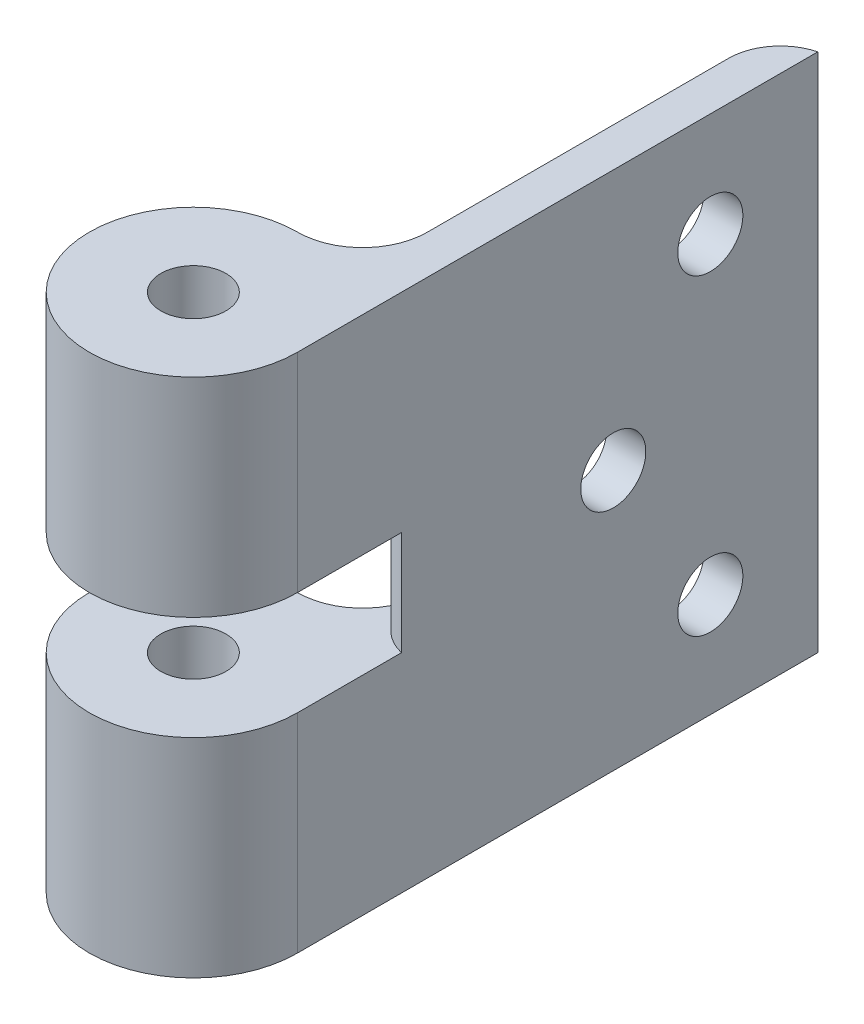
ISO-10303-21;
HEADER;
FILE_DESCRIPTION(('STEP AP214'),'2;1');
FILE_NAME('part.step','',(''),(''),'','','');
FILE_SCHEMA(('AUTOMOTIVE_DESIGN { 1 0 10303 214 1 1 1 1 }'));
ENDSEC;
DATA;
#1=APPLICATION_CONTEXT('core data for automotive mechanical design processes');
#2=APPLICATION_PROTOCOL_DEFINITION('international standard','automotive_design',2000,#1);
#3=PRODUCT_CONTEXT('',#1,'mechanical');
#4=PRODUCT('Part','Part','',(#3));
#5=PRODUCT_RELATED_PRODUCT_CATEGORY('part','',(#4));
#6=PRODUCT_DEFINITION_FORMATION('','',#4);
#7=PRODUCT_DEFINITION_CONTEXT('part definition',#1,'design');
#8=PRODUCT_DEFINITION('design','',#6,#7);
#9=PRODUCT_DEFINITION_SHAPE('','',#8);
#10=(LENGTH_UNIT() NAMED_UNIT(*) SI_UNIT(.MILLI.,.METRE.));
#11=(NAMED_UNIT(*) PLANE_ANGLE_UNIT() SI_UNIT($,.RADIAN.));
#12=(NAMED_UNIT(*) SI_UNIT($,.STERADIAN.) SOLID_ANGLE_UNIT());
#13=UNCERTAINTY_MEASURE_WITH_UNIT(LENGTH_MEASURE(1.E-05),#10,'distance_accuracy_value','');
#14=(GEOMETRIC_REPRESENTATION_CONTEXT(3) GLOBAL_UNCERTAINTY_ASSIGNED_CONTEXT((#13)) GLOBAL_UNIT_ASSIGNED_CONTEXT((#10,
#11,#12)) REPRESENTATION_CONTEXT('',''));
#15=CARTESIAN_POINT('',(0.,0.,0.));
#16=DIRECTION('',(0.,0.,1.));
#17=DIRECTION('',(1.,0.,0.));
#18=AXIS2_PLACEMENT_3D('',#15,#16,#17);
#19=CARTESIAN_POINT('',(0.,20.,0.));
#20=DIRECTION('',(0.,-1.,0.));
#21=DIRECTION('',(0.,0.,-1.));
#22=AXIS2_PLACEMENT_3D('',#19,#20,#21);
#23=CYLINDRICAL_SURFACE('',#22,4.);
#24=DIRECTION('',(0.,-1.,0.));
#25=VECTOR('',#24,1.);
#26=CARTESIAN_POINT('',(4.,20.,0.));
#27=LINE('',#26,#25);
#28=CARTESIAN_POINT('',(4.,8.,0.));
#29=VERTEX_POINT('',#28);
#30=CARTESIAN_POINT('',(4.,0.,0.));
#31=VERTEX_POINT('',#30);
#32=EDGE_CURVE('E202',#29,#31,#27,.T.);
#33=ORIENTED_EDGE('',*,*,#32,.F.);
#34=CARTESIAN_POINT('',(0.,8.,0.));
#35=DIRECTION('',(0.,-1.,0.));
#36=DIRECTION('',(0.,0.,-1.));
#37=AXIS2_PLACEMENT_3D('',#34,#35,#36);
#38=CIRCLE('',#37,4.);
#39=CARTESIAN_POINT('',(0.,8.,-4.));
#40=VERTEX_POINT('',#39);
#41=EDGE_CURVE('E117',#29,#40,#38,.T.);
#42=ORIENTED_EDGE('',*,*,#41,.T.);
#43=DIRECTION('',(0.,-1.,0.));
#44=VECTOR('',#43,1.);
#45=CARTESIAN_POINT('',(0.,20.,-4.));
#46=LINE('',#45,#44);
#47=CARTESIAN_POINT('',(0.,0.,-4.));
#48=VERTEX_POINT('',#47);
#49=EDGE_CURVE('E176',#40,#48,#46,.T.);
#50=ORIENTED_EDGE('',*,*,#49,.T.);
#51=CARTESIAN_POINT('',(0.,0.,0.));
#52=DIRECTION('',(0.,1.,0.));
#53=DIRECTION('',(0.,0.,1.));
#54=AXIS2_PLACEMENT_3D('',#51,#52,#53);
#55=CIRCLE('',#54,4.);
#56=EDGE_CURVE('E156',#48,#31,#55,.T.);
#57=ORIENTED_EDGE('',*,*,#56,.T.);
#58=EDGE_LOOP('',(#33,#42,#50,#57));
#59=FACE_BOUND('',#58,.T.);
#60=ADVANCED_FACE('F39',(#59),#23,.T.);
#61=CARTESIAN_POINT('',(0.,20.,0.));
#62=DIRECTION('',(0.,-1.,0.));
#63=DIRECTION('',(0.,0.,-1.));
#64=AXIS2_PLACEMENT_3D('',#61,#62,#63);
#65=CYLINDRICAL_SURFACE('',#64,1.25);
#66=CARTESIAN_POINT('',(0.,12.,0.));
#67=DIRECTION('',(0.,1.,0.));
#68=DIRECTION('',(0.,0.,1.));
#69=AXIS2_PLACEMENT_3D('',#66,#67,#68);
#70=CIRCLE('',#69,1.25);
#71=CARTESIAN_POINT('',(0.,12.,1.25));
#72=VERTEX_POINT('',#71);
#73=EDGE_CURVE('E135',#72,#72,#70,.T.);
#74=ORIENTED_EDGE('',*,*,#73,.F.);
#75=EDGE_LOOP('',(#74));
#76=FACE_BOUND('',#75,.T.);
#77=CARTESIAN_POINT('',(0.,20.,0.));
#78=DIRECTION('',(0.,1.,0.));
#79=DIRECTION('',(0.,0.,1.));
#80=AXIS2_PLACEMENT_3D('',#77,#78,#79);
#81=CIRCLE('',#80,1.25);
#82=CARTESIAN_POINT('',(0.,20.,1.25));
#83=VERTEX_POINT('',#82);
#84=EDGE_CURVE('E152',#83,#83,#81,.T.);
#85=ORIENTED_EDGE('',*,*,#84,.T.);
#86=EDGE_LOOP('',(#85));
#87=FACE_BOUND('',#86,.T.);
#88=ADVANCED_FACE('F286',(#76,#87),#65,.F.);
#89=CARTESIAN_POINT('',(0.,20.,0.));
#90=DIRECTION('',(0.,1.,0.));
#91=DIRECTION('',(0.,0.,1.));
#92=AXIS2_PLACEMENT_3D('',#89,#90,#91);
#93=PLANE('',#92);
#94=DIRECTION('',(0.,0.,-1.));
#95=VECTOR('',#94,1.);
#96=CARTESIAN_POINT('',(4.,20.,0.));
#97=LINE('',#96,#95);
#98=CARTESIAN_POINT('',(4.,20.,0.));
#99=VERTEX_POINT('',#98);
#100=CARTESIAN_POINT('',(4.,20.,-20.));
#101=VERTEX_POINT('',#100);
#102=EDGE_CURVE('E166',#99,#101,#97,.T.);
#103=ORIENTED_EDGE('',*,*,#102,.T.);
#104=CARTESIAN_POINT('',(4.5,20.,-18.0635083268963));
#105=DIRECTION('',(0.,1.,0.));
#106=DIRECTION('',(0.,0.,1.));
#107=AXIS2_PLACEMENT_3D('',#104,#105,#106);
#108=CIRCLE('',#107,2.);
#109=CARTESIAN_POINT('',(2.5,20.,-18.0635083268963));
#110=VERTEX_POINT('',#109);
#111=EDGE_CURVE('E229',#101,#110,#108,.T.);
#112=ORIENTED_EDGE('',*,*,#111,.T.);
#113=DIRECTION('',(0.,0.,1.));
#114=VECTOR('',#113,1.);
#115=CARTESIAN_POINT('',(2.5,20.,-15.1200276625702));
#116=LINE('',#115,#114);
#117=CARTESIAN_POINT('',(2.5,20.,-6.5));
#118=VERTEX_POINT('',#117);
#119=EDGE_CURVE('E170',#110,#118,#116,.T.);
#120=ORIENTED_EDGE('',*,*,#119,.T.);
#121=CARTESIAN_POINT('',(0.,20.,-6.5));
#122=DIRECTION('',(0.,-1.,0.));
#123=DIRECTION('',(0.,0.,-1.));
#124=AXIS2_PLACEMENT_3D('',#121,#122,#123);
#125=CIRCLE('',#124,2.5);
#126=CARTESIAN_POINT('',(0.,20.,-4.));
#127=VERTEX_POINT('',#126);
#128=EDGE_CURVE('E173',#118,#127,#125,.T.);
#129=ORIENTED_EDGE('',*,*,#128,.T.);
#130=CARTESIAN_POINT('',(0.,20.,0.));
#131=DIRECTION('',(0.,1.,0.));
#132=DIRECTION('',(0.,0.,1.));
#133=AXIS2_PLACEMENT_3D('',#130,#131,#132);
#134=CIRCLE('',#133,4.);
#135=EDGE_CURVE('E162',#127,#99,#134,.T.);
#136=ORIENTED_EDGE('',*,*,#135,.T.);
#137=EDGE_LOOP('',(#103,#112,#120,#129,#136));
#138=FACE_BOUND('',#137,.T.);
#139=ORIENTED_EDGE('',*,*,#84,.F.);
#140=EDGE_LOOP('',(#139));
#141=FACE_BOUND('',#140,.T.);
#142=ADVANCED_FACE('F261',(#138,#141),#93,.T.);
#143=CARTESIAN_POINT('',(0.,0.,0.));
#144=DIRECTION('',(0.,1.,0.));
#145=DIRECTION('',(0.,0.,1.));
#146=AXIS2_PLACEMENT_3D('',#143,#144,#145);
#147=PLANE('',#146);
#148=DIRECTION('',(0.,0.,1.));
#149=VECTOR('',#148,1.);
#150=CARTESIAN_POINT('',(2.5,0.,-6.5));
#151=LINE('',#150,#149);
#152=CARTESIAN_POINT('',(2.5,0.,-18.0635083268963));
#153=VERTEX_POINT('',#152);
#154=CARTESIAN_POINT('',(2.5,0.,-6.5));
#155=VERTEX_POINT('',#154);
#156=EDGE_CURVE('E184',#153,#155,#151,.T.);
#157=ORIENTED_EDGE('',*,*,#156,.F.);
#158=CARTESIAN_POINT('',(4.5,0.,-18.0635083268963));
#159=DIRECTION('',(0.,1.,0.));
#160=DIRECTION('',(0.,0.,1.));
#161=AXIS2_PLACEMENT_3D('',#158,#159,#160);
#162=CIRCLE('',#161,2.);
#163=CARTESIAN_POINT('',(4.,0.,-20.));
#164=VERTEX_POINT('',#163);
#165=EDGE_CURVE('E226',#153,#164,#162,.F.);
#166=ORIENTED_EDGE('',*,*,#165,.T.);
#167=DIRECTION('',(0.,0.,-1.));
#168=VECTOR('',#167,1.);
#169=CARTESIAN_POINT('',(4.,0.,0.));
#170=LINE('',#169,#168);
#171=EDGE_CURVE('E180',#31,#164,#170,.T.);
#172=ORIENTED_EDGE('',*,*,#171,.F.);
#173=ORIENTED_EDGE('',*,*,#56,.F.);
#174=CARTESIAN_POINT('',(0.,0.,-6.5));
#175=DIRECTION('',(0.,-1.,0.));
#176=DIRECTION('',(0.,0.,-1.));
#177=AXIS2_PLACEMENT_3D('',#174,#175,#176);
#178=CIRCLE('',#177,2.5);
#179=EDGE_CURVE('E167',#155,#48,#178,.T.);
#180=ORIENTED_EDGE('',*,*,#179,.F.);
#181=EDGE_LOOP('',(#157,#166,#172,#173,#180));
#182=FACE_BOUND('',#181,.T.);
#183=CARTESIAN_POINT('',(0.,0.,0.));
#184=DIRECTION('',(0.,1.,0.));
#185=DIRECTION('',(0.,0.,1.));
#186=AXIS2_PLACEMENT_3D('',#183,#184,#185);
#187=CIRCLE('',#186,1.25);
#188=CARTESIAN_POINT('',(0.,0.,1.25));
#189=VERTEX_POINT('',#188);
#190=EDGE_CURVE('E157',#189,#189,#187,.T.);
#191=ORIENTED_EDGE('',*,*,#190,.T.);
#192=EDGE_LOOP('',(#191));
#193=FACE_BOUND('',#192,.T.);
#194=ADVANCED_FACE('F249',(#182,#193),#147,.F.);
#195=CARTESIAN_POINT('',(0.,12.,-4.));
#196=VERTEX_POINT('',#195);
#197=EDGE_CURVE('E190',#127,#196,#46,.T.);
#198=ORIENTED_EDGE('',*,*,#197,.T.);
#199=CARTESIAN_POINT('',(0.,12.,0.));
#200=DIRECTION('',(0.,1.,0.));
#201=DIRECTION('',(0.,0.,1.));
#202=AXIS2_PLACEMENT_3D('',#199,#200,#201);
#203=CIRCLE('',#202,4.);
#204=CARTESIAN_POINT('',(4.,12.,0.));
#205=VERTEX_POINT('',#204);
#206=EDGE_CURVE('E136',#196,#205,#203,.T.);
#207=ORIENTED_EDGE('',*,*,#206,.T.);
#208=EDGE_CURVE('E203',#99,#205,#27,.T.);
#209=ORIENTED_EDGE('',*,*,#208,.F.);
#210=ORIENTED_EDGE('',*,*,#135,.F.);
#211=EDGE_LOOP('',(#198,#207,#209,#210));
#212=FACE_BOUND('',#211,.T.);
#213=ADVANCED_FACE('F267',(#212),#23,.T.);
#214=CARTESIAN_POINT('',(4.,20.,0.));
#215=DIRECTION('',(-1.,0.,0.));
#216=DIRECTION('',(0.,0.,1.));
#217=AXIS2_PLACEMENT_3D('',#214,#215,#216);
#218=PLANE('',#217);
#219=CARTESIAN_POINT('',(4.,10.,-12.1392364547432));
#220=DIRECTION('',(-1.,0.,0.));
#221=DIRECTION('',(0.,0.,1.));
#222=AXIS2_PLACEMENT_3D('',#219,#220,#221);
#223=CIRCLE('',#222,1.25);
#224=CARTESIAN_POINT('',(4.,10.,-10.8892364547432));
#225=VERTEX_POINT('',#224);
#226=EDGE_CURVE('E140',#225,#225,#223,.T.);
#227=ORIENTED_EDGE('',*,*,#226,.T.);
#228=EDGE_LOOP('',(#227));
#229=FACE_BOUND('',#228,.T.);
#230=CARTESIAN_POINT('',(4.,4.,-15.8687376200159));
#231=DIRECTION('',(-1.,0.,0.));
#232=DIRECTION('',(0.,0.,1.));
#233=AXIS2_PLACEMENT_3D('',#230,#231,#232);
#234=CIRCLE('',#233,1.25);
#235=CARTESIAN_POINT('',(4.,4.,-14.6187376200159));
#236=VERTEX_POINT('',#235);
#237=EDGE_CURVE('E145',#236,#236,#234,.T.);
#238=ORIENTED_EDGE('',*,*,#237,.T.);
#239=EDGE_LOOP('',(#238));
#240=FACE_BOUND('',#239,.T.);
#241=CARTESIAN_POINT('',(4.,16.,-15.8687376200159));
#242=DIRECTION('',(-1.,0.,0.));
#243=DIRECTION('',(0.,0.,1.));
#244=AXIS2_PLACEMENT_3D('',#241,#242,#243);
#245=CIRCLE('',#244,1.25);
#246=CARTESIAN_POINT('',(4.,16.,-14.6187376200159));
#247=VERTEX_POINT('',#246);
#248=EDGE_CURVE('E139',#247,#247,#245,.T.);
#249=ORIENTED_EDGE('',*,*,#248,.T.);
#250=EDGE_LOOP('',(#249));
#251=FACE_BOUND('',#250,.T.);
#252=ORIENTED_EDGE('',*,*,#208,.T.);
#253=DIRECTION('',(0.,0.,1.));
#254=VECTOR('',#253,1.);
#255=CARTESIAN_POINT('',(4.,12.,-4.));
#256=LINE('',#255,#254);
#257=CARTESIAN_POINT('',(4.,12.,-4.));
#258=VERTEX_POINT('',#257);
#259=EDGE_CURVE('E126',#258,#205,#256,.T.);
#260=ORIENTED_EDGE('',*,*,#259,.F.);
#261=DIRECTION('',(0.,1.,0.));
#262=VECTOR('',#261,1.);
#263=CARTESIAN_POINT('',(4.,12.,-4.));
#264=LINE('',#263,#262);
#265=CARTESIAN_POINT('',(4.,8.,-4.));
#266=VERTEX_POINT('',#265);
#267=EDGE_CURVE('E109',#266,#258,#264,.T.);
#268=ORIENTED_EDGE('',*,*,#267,.F.);
#269=DIRECTION('',(0.,0.,-1.));
#270=VECTOR('',#269,1.);
#271=CARTESIAN_POINT('',(4.,8.,-4.));
#272=LINE('',#271,#270);
#273=EDGE_CURVE('E114',#29,#266,#272,.T.);
#274=ORIENTED_EDGE('',*,*,#273,.F.);
#275=ORIENTED_EDGE('',*,*,#32,.T.);
#276=ORIENTED_EDGE('',*,*,#171,.T.);
#277=DIRECTION('',(0.,-1.,0.));
#278=VECTOR('',#277,1.);
#279=CARTESIAN_POINT('',(4.,20.,-20.));
#280=LINE('',#279,#278);
#281=EDGE_CURVE('E198',#101,#164,#280,.T.);
#282=ORIENTED_EDGE('',*,*,#281,.F.);
#283=ORIENTED_EDGE('',*,*,#102,.F.);
#284=EDGE_LOOP('',(#252,#260,#268,#274,#275,#276,#282,#283));
#285=FACE_BOUND('',#284,.T.);
#286=ADVANCED_FACE('F124',(#229,#240,#251,#285),#218,.F.);
#287=CARTESIAN_POINT('',(2.5,20.,-6.5));
#288=DIRECTION('',(1.,0.,0.));
#289=DIRECTION('',(0.,0.,-1.));
#290=AXIS2_PLACEMENT_3D('',#287,#288,#289);
#291=PLANE('',#290);
#292=CARTESIAN_POINT('',(2.5,10.,-12.1392364547432));
#293=DIRECTION('',(1.,0.,0.));
#294=DIRECTION('',(0.,0.,-1.));
#295=AXIS2_PLACEMENT_3D('',#292,#293,#294);
#296=CIRCLE('',#295,1.25);
#297=CARTESIAN_POINT('',(2.5,10.,-13.3892364547432));
#298=VERTEX_POINT('',#297);
#299=EDGE_CURVE('E161',#298,#298,#296,.T.);
#300=ORIENTED_EDGE('',*,*,#299,.T.);
#301=EDGE_LOOP('',(#300));
#302=FACE_BOUND('',#301,.T.);
#303=CARTESIAN_POINT('',(2.5,4.,-15.8687376200159));
#304=DIRECTION('',(1.,0.,0.));
#305=DIRECTION('',(0.,0.,-1.));
#306=AXIS2_PLACEMENT_3D('',#303,#304,#305);
#307=CIRCLE('',#306,1.25);
#308=CARTESIAN_POINT('',(2.5,4.,-17.1187376200159));
#309=VERTEX_POINT('',#308);
#310=EDGE_CURVE('E210',#309,#309,#307,.T.);
#311=ORIENTED_EDGE('',*,*,#310,.T.);
#312=EDGE_LOOP('',(#311));
#313=FACE_BOUND('',#312,.T.);
#314=CARTESIAN_POINT('',(2.5,16.,-15.8687376200159));
#315=DIRECTION('',(1.,0.,0.));
#316=DIRECTION('',(0.,0.,-1.));
#317=AXIS2_PLACEMENT_3D('',#314,#315,#316);
#318=CIRCLE('',#317,1.25);
#319=CARTESIAN_POINT('',(2.5,16.,-17.1187376200159));
#320=VERTEX_POINT('',#319);
#321=EDGE_CURVE('E144',#320,#320,#318,.T.);
#322=ORIENTED_EDGE('',*,*,#321,.T.);
#323=EDGE_LOOP('',(#322));
#324=FACE_BOUND('',#323,.T.);
#325=ORIENTED_EDGE('',*,*,#119,.F.);
#326=DIRECTION('',(0.,-1.,0.));
#327=VECTOR('',#326,1.);
#328=CARTESIAN_POINT('',(2.5,20.,-18.0635083268963));
#329=LINE('',#328,#327);
#330=EDGE_CURVE('E206',#110,#153,#329,.T.);
#331=ORIENTED_EDGE('',*,*,#330,.T.);
#332=ORIENTED_EDGE('',*,*,#156,.T.);
#333=DIRECTION('',(0.,-1.,0.));
#334=VECTOR('',#333,1.);
#335=CARTESIAN_POINT('',(2.5,20.,-6.5));
#336=LINE('',#335,#334);
#337=EDGE_CURVE('E194',#118,#155,#336,.T.);
#338=ORIENTED_EDGE('',*,*,#337,.F.);
#339=EDGE_LOOP('',(#325,#331,#332,#338));
#340=FACE_BOUND('',#339,.T.);
#341=ADVANCED_FACE('F257',(#302,#313,#324,#340),#291,.F.);
#342=CARTESIAN_POINT('',(0.,20.,-6.5));
#343=DIRECTION('',(0.,-1.,0.));
#344=DIRECTION('',(0.,0.,-1.));
#345=AXIS2_PLACEMENT_3D('',#342,#343,#344);
#346=CYLINDRICAL_SURFACE('',#345,2.5);
#347=ORIENTED_EDGE('',*,*,#49,.F.);
#348=CARTESIAN_POINT('',(0.,8.,-6.5));
#349=DIRECTION('',(0.,-1.,0.));
#350=DIRECTION('',(0.,0.,-1.));
#351=AXIS2_PLACEMENT_3D('',#348,#349,#350);
#352=CIRCLE('',#351,2.5);
#353=CARTESIAN_POINT('',(2.48091584956299,8.,-6.19168758152301));
#354=VERTEX_POINT('',#353);
#355=EDGE_CURVE('E55',#40,#354,#352,.F.);
#356=ORIENTED_EDGE('',*,*,#355,.T.);
#357=DIRECTION('',(0.,-1.,0.));
#358=VECTOR('',#357,1.);
#359=CARTESIAN_POINT('',(2.48091584956299,20.,-6.19168758152301));
#360=LINE('',#359,#358);
#361=CARTESIAN_POINT('',(2.48091584956299,12.,-6.19168758152301));
#362=VERTEX_POINT('',#361);
#363=EDGE_CURVE('E111',#354,#362,#360,.F.);
#364=ORIENTED_EDGE('',*,*,#363,.T.);
#365=CARTESIAN_POINT('',(0.,12.,-6.5));
#366=DIRECTION('',(0.,1.,0.));
#367=DIRECTION('',(0.,0.,1.));
#368=AXIS2_PLACEMENT_3D('',#365,#366,#367);
#369=CIRCLE('',#368,2.5);
#370=EDGE_CURVE('E232',#362,#196,#369,.F.);
#371=ORIENTED_EDGE('',*,*,#370,.T.);
#372=ORIENTED_EDGE('',*,*,#197,.F.);
#373=ORIENTED_EDGE('',*,*,#128,.F.);
#374=ORIENTED_EDGE('',*,*,#337,.T.);
#375=ORIENTED_EDGE('',*,*,#179,.T.);
#376=EDGE_LOOP('',(#347,#356,#364,#371,#372,#373,#374,#375));
#377=FACE_BOUND('',#376,.T.);
#378=ADVANCED_FACE('F239',(#377),#346,.F.);
#379=CARTESIAN_POINT('',(0.,8.,0.));
#380=DIRECTION('',(0.,-1.,0.));
#381=DIRECTION('',(0.,0.,-1.));
#382=AXIS2_PLACEMENT_3D('',#379,#380,#381);
#383=CIRCLE('',#382,1.25);
#384=CARTESIAN_POINT('',(0.,8.,-1.25));
#385=VERTEX_POINT('',#384);
#386=EDGE_CURVE('E130',#385,#385,#383,.T.);
#387=ORIENTED_EDGE('',*,*,#386,.F.);
#388=EDGE_LOOP('',(#387));
#389=FACE_BOUND('',#388,.T.);
#390=ORIENTED_EDGE('',*,*,#190,.F.);
#391=EDGE_LOOP('',(#390));
#392=FACE_BOUND('',#391,.T.);
#393=ADVANCED_FACE('F293',(#389,#392),#65,.F.);
#394=CARTESIAN_POINT('',(4.,16.,-15.8687376200159));
#395=DIRECTION('',(-1.,0.,0.));
#396=DIRECTION('',(0.,0.,1.));
#397=AXIS2_PLACEMENT_3D('',#394,#395,#396);
#398=CYLINDRICAL_SURFACE('',#397,1.25);
#399=ORIENTED_EDGE('',*,*,#248,.F.);
#400=EDGE_LOOP('',(#399));
#401=FACE_BOUND('',#400,.T.);
#402=ORIENTED_EDGE('',*,*,#321,.F.);
#403=EDGE_LOOP('',(#402));
#404=FACE_BOUND('',#403,.T.);
#405=ADVANCED_FACE('F319',(#401,#404),#398,.F.);
#406=CARTESIAN_POINT('',(4.,4.,-15.8687376200159));
#407=DIRECTION('',(-1.,0.,0.));
#408=DIRECTION('',(0.,0.,1.));
#409=AXIS2_PLACEMENT_3D('',#406,#407,#408);
#410=CYLINDRICAL_SURFACE('',#409,1.25);
#411=ORIENTED_EDGE('',*,*,#237,.F.);
#412=EDGE_LOOP('',(#411));
#413=FACE_BOUND('',#412,.T.);
#414=ORIENTED_EDGE('',*,*,#310,.F.);
#415=EDGE_LOOP('',(#414));
#416=FACE_BOUND('',#415,.T.);
#417=ADVANCED_FACE('F282',(#413,#416),#410,.F.);
#418=CARTESIAN_POINT('',(4.,10.,-12.1392364547432));
#419=DIRECTION('',(-1.,0.,0.));
#420=DIRECTION('',(0.,0.,1.));
#421=AXIS2_PLACEMENT_3D('',#418,#419,#420);
#422=CYLINDRICAL_SURFACE('',#421,1.25);
#423=ORIENTED_EDGE('',*,*,#226,.F.);
#424=EDGE_LOOP('',(#423));
#425=FACE_BOUND('',#424,.T.);
#426=ORIENTED_EDGE('',*,*,#299,.F.);
#427=EDGE_LOOP('',(#426));
#428=FACE_BOUND('',#427,.T.);
#429=ADVANCED_FACE('F272',(#425,#428),#422,.F.);
#430=CARTESIAN_POINT('',(-4.,12.,-4.));
#431=DIRECTION('',(0.,1.,0.));
#432=DIRECTION('',(0.,0.,1.));
#433=AXIS2_PLACEMENT_3D('',#430,#431,#432);
#434=PLANE('',#433);
#435=ORIENTED_EDGE('',*,*,#73,.T.);
#436=EDGE_LOOP('',(#435));
#437=FACE_BOUND('',#436,.T.);
#438=ORIENTED_EDGE('',*,*,#206,.F.);
#439=ORIENTED_EDGE('',*,*,#370,.F.);
#440=CARTESIAN_POINT('',(4.46564852921339,12.,-5.94503764674142));
#441=DIRECTION('',(0.,1.,0.));
#442=DIRECTION('',(0.,0.,1.));
#443=AXIS2_PLACEMENT_3D('',#440,#441,#442);
#444=CIRCLE('',#443,2.);
#445=EDGE_CURVE('E11',#362,#258,#444,.T.);
#446=ORIENTED_EDGE('',*,*,#445,.T.);
#447=ORIENTED_EDGE('',*,*,#259,.T.);
#448=EDGE_LOOP('',(#438,#439,#446,#447));
#449=FACE_BOUND('',#448,.T.);
#450=ADVANCED_FACE('F270',(#437,#449),#434,.F.);
#451=CARTESIAN_POINT('',(-4.,8.,-4.));
#452=DIRECTION('',(0.,-1.,0.));
#453=DIRECTION('',(0.,0.,-1.));
#454=AXIS2_PLACEMENT_3D('',#451,#452,#453);
#455=PLANE('',#454);
#456=ORIENTED_EDGE('',*,*,#386,.T.);
#457=EDGE_LOOP('',(#456));
#458=FACE_BOUND('',#457,.T.);
#459=ORIENTED_EDGE('',*,*,#273,.T.);
#460=CARTESIAN_POINT('',(4.46564852921339,8.,-5.94503764674142));
#461=DIRECTION('',(0.,-1.,0.));
#462=DIRECTION('',(0.,0.,-1.));
#463=AXIS2_PLACEMENT_3D('',#460,#461,#462);
#464=CIRCLE('',#463,2.);
#465=EDGE_CURVE('E48',#266,#354,#464,.T.);
#466=ORIENTED_EDGE('',*,*,#465,.T.);
#467=ORIENTED_EDGE('',*,*,#355,.F.);
#468=ORIENTED_EDGE('',*,*,#41,.F.);
#469=EDGE_LOOP('',(#459,#466,#467,#468));
#470=FACE_BOUND('',#469,.T.);
#471=ADVANCED_FACE('F115',(#458,#470),#455,.F.);
#472=CARTESIAN_POINT('',(4.5,20.,-18.0635083268963));
#473=DIRECTION('',(0.,-1.,0.));
#474=DIRECTION('',(0.,0.,-1.));
#475=AXIS2_PLACEMENT_3D('',#472,#473,#474);
#476=CYLINDRICAL_SURFACE('',#475,2.);
#477=ORIENTED_EDGE('',*,*,#111,.F.);
#478=ORIENTED_EDGE('',*,*,#281,.T.);
#479=ORIENTED_EDGE('',*,*,#165,.F.);
#480=ORIENTED_EDGE('',*,*,#330,.F.);
#481=EDGE_LOOP('',(#477,#478,#479,#480));
#482=FACE_BOUND('',#481,.T.);
#483=ADVANCED_FACE('F254',(#482),#476,.T.);
#484=CARTESIAN_POINT('',(4.46564852921339,20.,-5.94503764674142));
#485=DIRECTION('',(0.,-1.,0.));
#486=DIRECTION('',(0.,0.,-1.));
#487=AXIS2_PLACEMENT_3D('',#484,#485,#486);
#488=CYLINDRICAL_SURFACE('',#487,2.);
#489=ORIENTED_EDGE('',*,*,#445,.F.);
#490=ORIENTED_EDGE('',*,*,#363,.F.);
#491=ORIENTED_EDGE('',*,*,#465,.F.);
#492=ORIENTED_EDGE('',*,*,#267,.T.);
#493=EDGE_LOOP('',(#489,#490,#491,#492));
#494=FACE_BOUND('',#493,.T.);
#495=ADVANCED_FACE('F41',(#494),#488,.T.);
#496=CLOSED_SHELL('',(#60,#88,#142,#194,#213,#286,#341,#378,#393,#405,#417,#429,#450,#471,#483,#495));
#497=MANIFOLD_SOLID_BREP('B2',#496);
#498=ADVANCED_BREP_SHAPE_REPRESENTATION('',(#18,#497),#14);
#499=SHAPE_DEFINITION_REPRESENTATION(#9,#498);
ENDSEC;
END-ISO-10303-21;
